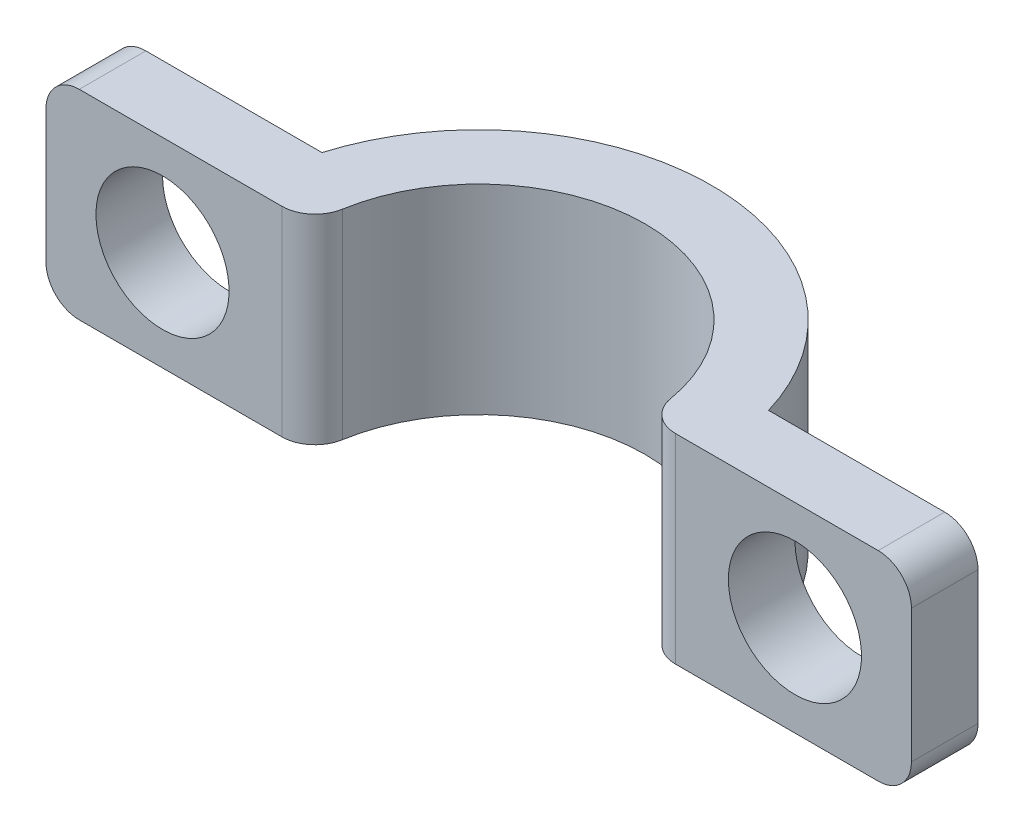
ISO-10303-21;
HEADER;
FILE_DESCRIPTION(('STEP AP214'),'2;1');
FILE_NAME('part.step','',(''),(''),'','','');
FILE_SCHEMA(('AUTOMOTIVE_DESIGN { 1 0 10303 214 1 1 1 1 }'));
ENDSEC;
DATA;
#1=APPLICATION_CONTEXT('core data for automotive mechanical design processes');
#2=APPLICATION_PROTOCOL_DEFINITION('international standard','automotive_design',2000,#1);
#3=PRODUCT_CONTEXT('',#1,'mechanical');
#4=PRODUCT('Part','Part','',(#3));
#5=PRODUCT_RELATED_PRODUCT_CATEGORY('part','',(#4));
#6=PRODUCT_DEFINITION_FORMATION('','',#4);
#7=PRODUCT_DEFINITION_CONTEXT('part definition',#1,'design');
#8=PRODUCT_DEFINITION('design','',#6,#7);
#9=PRODUCT_DEFINITION_SHAPE('','',#8);
#10=(LENGTH_UNIT() NAMED_UNIT(*) SI_UNIT(.MILLI.,.METRE.));
#11=(NAMED_UNIT(*) PLANE_ANGLE_UNIT() SI_UNIT($,.RADIAN.));
#12=(NAMED_UNIT(*) SI_UNIT($,.STERADIAN.) SOLID_ANGLE_UNIT());
#13=UNCERTAINTY_MEASURE_WITH_UNIT(LENGTH_MEASURE(1.E-05),#10,'distance_accuracy_value','');
#14=(GEOMETRIC_REPRESENTATION_CONTEXT(3) GLOBAL_UNCERTAINTY_ASSIGNED_CONTEXT((#13)) GLOBAL_UNIT_ASSIGNED_CONTEXT((#10,
#11,#12)) REPRESENTATION_CONTEXT('',''));
#15=CARTESIAN_POINT('',(0.,0.,0.));
#16=DIRECTION('',(0.,0.,1.));
#17=DIRECTION('',(1.,0.,0.));
#18=AXIS2_PLACEMENT_3D('',#15,#16,#17);
#19=CARTESIAN_POINT('',(0.,6.,0.));
#20=DIRECTION('',(0.,-1.,0.));
#21=DIRECTION('',(0.,0.,-1.));
#22=AXIS2_PLACEMENT_3D('',#19,#20,#21);
#23=CYLINDRICAL_SURFACE('',#22,5.);
#24=CARTESIAN_POINT('',(0.,0.,0.));
#25=DIRECTION('',(0.,-1.,0.));
#26=DIRECTION('',(0.,0.,1.));
#27=AXIS2_PLACEMENT_3D('',#24,#25,#26);
#28=CIRCLE('',#27,5.);
#29=CARTESIAN_POINT('',(-4.93006648591635,0.,-0.833333333333333));
#30=VERTEX_POINT('',#29);
#31=CARTESIAN_POINT('',(4.93006648591635,0.,-0.833333333333333));
#32=VERTEX_POINT('',#31);
#33=EDGE_CURVE('E180',#30,#32,#28,.T.);
#34=ORIENTED_EDGE('',*,*,#33,.T.);
#35=DIRECTION('',(0.,-1.,0.));
#36=VECTOR('',#35,1.);
#37=CARTESIAN_POINT('',(4.93006648591635,6.,-0.833333333333333));
#38=LINE('',#37,#36);
#39=CARTESIAN_POINT('',(4.93006648591635,6.,-0.833333333333333));
#40=VERTEX_POINT('',#39);
#41=EDGE_CURVE('E210',#32,#40,#38,.F.);
#42=ORIENTED_EDGE('',*,*,#41,.T.);
#43=CARTESIAN_POINT('',(0.,6.,0.));
#44=DIRECTION('',(0.,-1.,0.));
#45=DIRECTION('',(0.,0.,1.));
#46=AXIS2_PLACEMENT_3D('',#43,#44,#45);
#47=CIRCLE('',#46,5.);
#48=CARTESIAN_POINT('',(-4.93006648591635,6.,-0.833333333333333));
#49=VERTEX_POINT('',#48);
#50=EDGE_CURVE('E176',#49,#40,#47,.T.);
#51=ORIENTED_EDGE('',*,*,#50,.F.);
#52=DIRECTION('',(0.,-1.,0.));
#53=VECTOR('',#52,1.);
#54=CARTESIAN_POINT('',(-4.93006648591635,6.,-0.833333333333333));
#55=LINE('',#54,#53);
#56=EDGE_CURVE('E207',#49,#30,#55,.T.);
#57=ORIENTED_EDGE('',*,*,#56,.T.);
#58=EDGE_LOOP('',(#34,#42,#51,#57));
#59=FACE_BOUND('',#58,.T.);
#60=ADVANCED_FACE('F39',(#59),#23,.F.);
#61=CARTESIAN_POINT('',(5.,6.,0.));
#62=DIRECTION('',(0.,0.,-1.));
#63=DIRECTION('',(-1.,0.,0.));
#64=AXIS2_PLACEMENT_3D('',#61,#62,#63);
#65=PLANE('',#64);
#66=CARTESIAN_POINT('',(9.5,3.,0.));
#67=DIRECTION('',(0.,0.,-1.));
#68=DIRECTION('',(-1.,0.,0.));
#69=AXIS2_PLACEMENT_3D('',#66,#67,#68);
#70=CIRCLE('',#69,2.);
#71=CARTESIAN_POINT('',(7.5,3.,0.));
#72=VERTEX_POINT('',#71);
#73=EDGE_CURVE('E153',#72,#72,#70,.T.);
#74=ORIENTED_EDGE('',*,*,#73,.T.);
#75=EDGE_LOOP('',(#74));
#76=FACE_BOUND('',#75,.T.);
#77=DIRECTION('',(1.,0.,0.));
#78=VECTOR('',#77,1.);
#79=CARTESIAN_POINT('',(5.,6.,0.));
#80=LINE('',#79,#78);
#81=CARTESIAN_POINT('',(5.91607978309962,6.,0.));
#82=VERTEX_POINT('',#81);
#83=CARTESIAN_POINT('',(12.,6.,0.));
#84=VERTEX_POINT('',#83);
#85=EDGE_CURVE('E170',#82,#84,#80,.T.);
#86=ORIENTED_EDGE('',*,*,#85,.F.);
#87=DIRECTION('',(0.,-1.,0.));
#88=VECTOR('',#87,1.);
#89=CARTESIAN_POINT('',(5.91607978309962,6.,0.));
#90=LINE('',#89,#88);
#91=CARTESIAN_POINT('',(5.91607978309962,0.,0.));
#92=VERTEX_POINT('',#91);
#93=EDGE_CURVE('E194',#82,#92,#90,.T.);
#94=ORIENTED_EDGE('',*,*,#93,.T.);
#95=DIRECTION('',(1.,0.,0.));
#96=VECTOR('',#95,1.);
#97=CARTESIAN_POINT('',(5.,0.,0.));
#98=LINE('',#97,#96);
#99=CARTESIAN_POINT('',(12.,0.,0.));
#100=VERTEX_POINT('',#99);
#101=EDGE_CURVE('E183',#92,#100,#98,.T.);
#102=ORIENTED_EDGE('',*,*,#101,.T.);
#103=CARTESIAN_POINT('',(12.,1.,0.));
#104=DIRECTION('',(0.,0.,-1.));
#105=DIRECTION('',(-1.,0.,0.));
#106=AXIS2_PLACEMENT_3D('',#103,#104,#105);
#107=CIRCLE('',#106,1.);
#108=CARTESIAN_POINT('',(13.,1.,0.));
#109=VERTEX_POINT('',#108);
#110=EDGE_CURVE('E192',#100,#109,#107,.F.);
#111=ORIENTED_EDGE('',*,*,#110,.T.);
#112=DIRECTION('',(0.,1.,0.));
#113=VECTOR('',#112,1.);
#114=CARTESIAN_POINT('',(13.,-6.60202224738878,0.));
#115=LINE('',#114,#113);
#116=CARTESIAN_POINT('',(13.,5.,0.));
#117=VERTEX_POINT('',#116);
#118=EDGE_CURVE('E238',#109,#117,#115,.T.);
#119=ORIENTED_EDGE('',*,*,#118,.T.);
#120=CARTESIAN_POINT('',(12.,5.,0.));
#121=DIRECTION('',(0.,0.,-1.));
#122=DIRECTION('',(-1.,0.,0.));
#123=AXIS2_PLACEMENT_3D('',#120,#121,#122);
#124=CIRCLE('',#123,1.);
#125=EDGE_CURVE('E173',#117,#84,#124,.F.);
#126=ORIENTED_EDGE('',*,*,#125,.T.);
#127=EDGE_LOOP('',(#86,#94,#102,#111,#119,#126));
#128=FACE_BOUND('',#127,.T.);
#129=ADVANCED_FACE('F244',(#76,#128),#65,.F.);
#130=CARTESIAN_POINT('',(0.,6.,0.));
#131=DIRECTION('',(0.,-1.,0.));
#132=DIRECTION('',(0.,0.,-1.));
#133=AXIS2_PLACEMENT_3D('',#130,#131,#132);
#134=CYLINDRICAL_SURFACE('',#133,7.);
#135=CARTESIAN_POINT('',(0.,0.,0.));
#136=DIRECTION('',(0.,1.,0.));
#137=DIRECTION('',(0.,0.,1.));
#138=AXIS2_PLACEMENT_3D('',#135,#136,#137);
#139=CIRCLE('',#138,7.);
#140=CARTESIAN_POINT('',(6.70820393249937,0.,-2.));
#141=VERTEX_POINT('',#140);
#142=CARTESIAN_POINT('',(-6.70820393249937,0.,-2.));
#143=VERTEX_POINT('',#142);
#144=EDGE_CURVE('E161',#141,#143,#139,.T.);
#145=ORIENTED_EDGE('',*,*,#144,.T.);
#146=DIRECTION('',(0.,1.,0.));
#147=VECTOR('',#146,1.);
#148=CARTESIAN_POINT('',(-6.70820393249937,-6.60202224738878,-2.));
#149=LINE('',#148,#147);
#150=CARTESIAN_POINT('',(-6.70820393249937,6.,-2.));
#151=VERTEX_POINT('',#150);
#152=EDGE_CURVE('E143',#143,#151,#149,.T.);
#153=ORIENTED_EDGE('',*,*,#152,.T.);
#154=CARTESIAN_POINT('',(0.,6.,0.));
#155=DIRECTION('',(0.,1.,0.));
#156=DIRECTION('',(0.,0.,1.));
#157=AXIS2_PLACEMENT_3D('',#154,#155,#156);
#158=CIRCLE('',#157,7.);
#159=CARTESIAN_POINT('',(6.70820393249937,6.,-2.));
#160=VERTEX_POINT('',#159);
#161=EDGE_CURVE('E159',#160,#151,#158,.T.);
#162=ORIENTED_EDGE('',*,*,#161,.F.);
#163=DIRECTION('',(0.,1.,0.));
#164=VECTOR('',#163,1.);
#165=CARTESIAN_POINT('',(6.70820393249937,-6.60202224738878,-2.));
#166=LINE('',#165,#164);
#167=EDGE_CURVE('E250',#141,#160,#166,.T.);
#168=ORIENTED_EDGE('',*,*,#167,.F.);
#169=EDGE_LOOP('',(#145,#153,#162,#168));
#170=FACE_BOUND('',#169,.T.);
#171=ADVANCED_FACE('F157',(#170),#134,.T.);
#172=CARTESIAN_POINT('',(-5.,6.,0.));
#173=DIRECTION('',(0.,0.,-1.));
#174=DIRECTION('',(-1.,0.,0.));
#175=AXIS2_PLACEMENT_3D('',#172,#173,#174);
#176=PLANE('',#175);
#177=CARTESIAN_POINT('',(-9.5,3.,0.));
#178=DIRECTION('',(0.,0.,-1.));
#179=DIRECTION('',(-1.,0.,0.));
#180=AXIS2_PLACEMENT_3D('',#177,#178,#179);
#181=CIRCLE('',#180,2.);
#182=CARTESIAN_POINT('',(-11.5,3.,0.));
#183=VERTEX_POINT('',#182);
#184=EDGE_CURVE('E319',#183,#183,#181,.T.);
#185=ORIENTED_EDGE('',*,*,#184,.T.);
#186=EDGE_LOOP('',(#185));
#187=FACE_BOUND('',#186,.T.);
#188=DIRECTION('',(1.,0.,0.));
#189=VECTOR('',#188,1.);
#190=CARTESIAN_POINT('',(-5.,0.,0.));
#191=LINE('',#190,#189);
#192=CARTESIAN_POINT('',(-12.,0.,0.));
#193=VERTEX_POINT('',#192);
#194=CARTESIAN_POINT('',(-5.91607978309962,0.,0.));
#195=VERTEX_POINT('',#194);
#196=EDGE_CURVE('E188',#193,#195,#191,.T.);
#197=ORIENTED_EDGE('',*,*,#196,.T.);
#198=DIRECTION('',(0.,-1.,0.));
#199=VECTOR('',#198,1.);
#200=CARTESIAN_POINT('',(-5.91607978309962,6.,0.));
#201=LINE('',#200,#199);
#202=CARTESIAN_POINT('',(-5.91607978309962,6.,0.));
#203=VERTEX_POINT('',#202);
#204=EDGE_CURVE('E224',#195,#203,#201,.F.);
#205=ORIENTED_EDGE('',*,*,#204,.T.);
#206=DIRECTION('',(1.,0.,0.));
#207=VECTOR('',#206,1.);
#208=CARTESIAN_POINT('',(-5.,6.,0.));
#209=LINE('',#208,#207);
#210=CARTESIAN_POINT('',(-12.,6.,0.));
#211=VERTEX_POINT('',#210);
#212=EDGE_CURVE('E169',#211,#203,#209,.T.);
#213=ORIENTED_EDGE('',*,*,#212,.F.);
#214=CARTESIAN_POINT('',(-12.,5.,0.));
#215=DIRECTION('',(0.,0.,-1.));
#216=DIRECTION('',(-1.,0.,0.));
#217=AXIS2_PLACEMENT_3D('',#214,#215,#216);
#218=CIRCLE('',#217,1.);
#219=CARTESIAN_POINT('',(-13.,5.,0.));
#220=VERTEX_POINT('',#219);
#221=EDGE_CURVE('E220',#211,#220,#218,.F.);
#222=ORIENTED_EDGE('',*,*,#221,.T.);
#223=DIRECTION('',(0.,1.,0.));
#224=VECTOR('',#223,1.);
#225=CARTESIAN_POINT('',(-13.,-6.60202224738878,0.));
#226=LINE('',#225,#224);
#227=CARTESIAN_POINT('',(-13.,1.,0.));
#228=VERTEX_POINT('',#227);
#229=EDGE_CURVE('E163',#228,#220,#226,.T.);
#230=ORIENTED_EDGE('',*,*,#229,.F.);
#231=CARTESIAN_POINT('',(-12.,1.,0.));
#232=DIRECTION('',(0.,0.,-1.));
#233=DIRECTION('',(-1.,0.,0.));
#234=AXIS2_PLACEMENT_3D('',#231,#232,#233);
#235=CIRCLE('',#234,1.);
#236=EDGE_CURVE('E222',#228,#193,#235,.F.);
#237=ORIENTED_EDGE('',*,*,#236,.T.);
#238=EDGE_LOOP('',(#197,#205,#213,#222,#230,#237));
#239=FACE_BOUND('',#238,.T.);
#240=ADVANCED_FACE('F305',(#187,#239),#176,.F.);
#241=CARTESIAN_POINT('',(0.,6.,0.));
#242=DIRECTION('',(0.,1.,0.));
#243=DIRECTION('',(0.,0.,1.));
#244=AXIS2_PLACEMENT_3D('',#241,#242,#243);
#245=PLANE('',#244);
#246=ORIENTED_EDGE('',*,*,#50,.T.);
#247=CARTESIAN_POINT('',(5.91607978309962,6.,-1.));
#248=DIRECTION('',(0.,1.,0.));
#249=DIRECTION('',(0.,0.,1.));
#250=AXIS2_PLACEMENT_3D('',#247,#248,#249);
#251=CIRCLE('',#250,1.);
#252=EDGE_CURVE('E218',#40,#82,#251,.T.);
#253=ORIENTED_EDGE('',*,*,#252,.T.);
#254=ORIENTED_EDGE('',*,*,#85,.T.);
#255=DIRECTION('',(0.,0.,-1.));
#256=VECTOR('',#255,1.);
#257=CARTESIAN_POINT('',(12.,6.,0.));
#258=LINE('',#257,#256);
#259=CARTESIAN_POINT('',(12.,6.,-2.));
#260=VERTEX_POINT('',#259);
#261=EDGE_CURVE('E214',#84,#260,#258,.T.);
#262=ORIENTED_EDGE('',*,*,#261,.T.);
#263=DIRECTION('',(-1.,0.,0.));
#264=VECTOR('',#263,1.);
#265=CARTESIAN_POINT('',(13.,6.,-2.));
#266=LINE('',#265,#264);
#267=EDGE_CURVE('E168',#260,#160,#266,.T.);
#268=ORIENTED_EDGE('',*,*,#267,.T.);
#269=ORIENTED_EDGE('',*,*,#161,.T.);
#270=DIRECTION('',(-1.,0.,0.));
#271=VECTOR('',#270,1.);
#272=CARTESIAN_POINT('',(-13.,6.,-2.));
#273=LINE('',#272,#271);
#274=CARTESIAN_POINT('',(-12.,6.,-2.));
#275=VERTEX_POINT('',#274);
#276=EDGE_CURVE('E139',#151,#275,#273,.T.);
#277=ORIENTED_EDGE('',*,*,#276,.T.);
#278=DIRECTION('',(0.,0.,1.));
#279=VECTOR('',#278,1.);
#280=CARTESIAN_POINT('',(-12.,6.,0.));
#281=LINE('',#280,#279);
#282=EDGE_CURVE('E212',#275,#211,#281,.T.);
#283=ORIENTED_EDGE('',*,*,#282,.T.);
#284=ORIENTED_EDGE('',*,*,#212,.T.);
#285=CARTESIAN_POINT('',(-5.91607978309962,6.,-1.));
#286=DIRECTION('',(0.,1.,0.));
#287=DIRECTION('',(0.,0.,1.));
#288=AXIS2_PLACEMENT_3D('',#285,#286,#287);
#289=CIRCLE('',#288,1.);
#290=EDGE_CURVE('E216',#203,#49,#289,.T.);
#291=ORIENTED_EDGE('',*,*,#290,.T.);
#292=EDGE_LOOP('',(#246,#253,#254,#262,#268,#269,#277,#283,#284,#291));
#293=FACE_BOUND('',#292,.T.);
#294=ADVANCED_FACE('F166',(#293),#245,.T.);
#295=CARTESIAN_POINT('',(0.,0.,0.));
#296=DIRECTION('',(0.,1.,0.));
#297=DIRECTION('',(0.,0.,1.));
#298=AXIS2_PLACEMENT_3D('',#295,#296,#297);
#299=PLANE('',#298);
#300=ORIENTED_EDGE('',*,*,#101,.F.);
#301=CARTESIAN_POINT('',(5.91607978309962,0.,-1.));
#302=DIRECTION('',(0.,1.,0.));
#303=DIRECTION('',(0.,0.,1.));
#304=AXIS2_PLACEMENT_3D('',#301,#302,#303);
#305=CIRCLE('',#304,1.);
#306=EDGE_CURVE('E205',#92,#32,#305,.F.);
#307=ORIENTED_EDGE('',*,*,#306,.T.);
#308=ORIENTED_EDGE('',*,*,#33,.F.);
#309=CARTESIAN_POINT('',(-5.91607978309962,0.,-1.));
#310=DIRECTION('',(0.,1.,0.));
#311=DIRECTION('',(0.,0.,1.));
#312=AXIS2_PLACEMENT_3D('',#309,#310,#311);
#313=CIRCLE('',#312,1.);
#314=EDGE_CURVE('E203',#30,#195,#313,.F.);
#315=ORIENTED_EDGE('',*,*,#314,.T.);
#316=ORIENTED_EDGE('',*,*,#196,.F.);
#317=DIRECTION('',(0.,0.,-1.));
#318=VECTOR('',#317,1.);
#319=CARTESIAN_POINT('',(-12.,0.,-2.));
#320=LINE('',#319,#318);
#321=CARTESIAN_POINT('',(-12.,0.,-2.));
#322=VERTEX_POINT('',#321);
#323=EDGE_CURVE('E200',#193,#322,#320,.T.);
#324=ORIENTED_EDGE('',*,*,#323,.T.);
#325=DIRECTION('',(1.,0.,0.));
#326=VECTOR('',#325,1.);
#327=CARTESIAN_POINT('',(-13.,0.,-2.));
#328=LINE('',#327,#326);
#329=EDGE_CURVE('E162',#322,#143,#328,.T.);
#330=ORIENTED_EDGE('',*,*,#329,.T.);
#331=ORIENTED_EDGE('',*,*,#144,.F.);
#332=DIRECTION('',(1.,0.,0.));
#333=VECTOR('',#332,1.);
#334=CARTESIAN_POINT('',(13.,0.,-2.));
#335=LINE('',#334,#333);
#336=CARTESIAN_POINT('',(12.,0.,-2.));
#337=VERTEX_POINT('',#336);
#338=EDGE_CURVE('E184',#141,#337,#335,.T.);
#339=ORIENTED_EDGE('',*,*,#338,.T.);
#340=DIRECTION('',(0.,0.,1.));
#341=VECTOR('',#340,1.);
#342=CARTESIAN_POINT('',(12.,0.,0.));
#343=LINE('',#342,#341);
#344=EDGE_CURVE('E197',#337,#100,#343,.T.);
#345=ORIENTED_EDGE('',*,*,#344,.T.);
#346=EDGE_LOOP('',(#300,#307,#308,#315,#316,#324,#330,#331,#339,#345));
#347=FACE_BOUND('',#346,.T.);
#348=ADVANCED_FACE('F268',(#347),#299,.F.);
#349=CARTESIAN_POINT('',(13.,-6.60202224738878,-2.));
#350=DIRECTION('',(0.,0.,-1.));
#351=DIRECTION('',(-1.,0.,0.));
#352=AXIS2_PLACEMENT_3D('',#349,#350,#351);
#353=PLANE('',#352);
#354=CARTESIAN_POINT('',(9.5,3.,-2.));
#355=DIRECTION('',(0.,0.,-1.));
#356=DIRECTION('',(-1.,0.,0.));
#357=AXIS2_PLACEMENT_3D('',#354,#355,#356);
#358=CIRCLE('',#357,2.);
#359=CARTESIAN_POINT('',(7.5,3.,-2.));
#360=VERTEX_POINT('',#359);
#361=EDGE_CURVE('E322',#360,#360,#358,.T.);
#362=ORIENTED_EDGE('',*,*,#361,.F.);
#363=EDGE_LOOP('',(#362));
#364=FACE_BOUND('',#363,.T.);
#365=DIRECTION('',(0.,1.,0.));
#366=VECTOR('',#365,1.);
#367=CARTESIAN_POINT('',(13.,-6.60202224738878,-2.));
#368=LINE('',#367,#366);
#369=CARTESIAN_POINT('',(13.,1.,-2.));
#370=VERTEX_POINT('',#369);
#371=CARTESIAN_POINT('',(13.,5.,-2.));
#372=VERTEX_POINT('',#371);
#373=EDGE_CURVE('E239',#370,#372,#368,.T.);
#374=ORIENTED_EDGE('',*,*,#373,.F.);
#375=CARTESIAN_POINT('',(12.,1.,-2.));
#376=DIRECTION('',(0.,0.,-1.));
#377=DIRECTION('',(-1.,0.,0.));
#378=AXIS2_PLACEMENT_3D('',#375,#376,#377);
#379=CIRCLE('',#378,1.);
#380=EDGE_CURVE('E11',#370,#337,#379,.T.);
#381=ORIENTED_EDGE('',*,*,#380,.T.);
#382=ORIENTED_EDGE('',*,*,#338,.F.);
#383=ORIENTED_EDGE('',*,*,#167,.T.);
#384=ORIENTED_EDGE('',*,*,#267,.F.);
#385=CARTESIAN_POINT('',(12.,5.,-2.));
#386=DIRECTION('',(0.,0.,-1.));
#387=DIRECTION('',(-1.,0.,0.));
#388=AXIS2_PLACEMENT_3D('',#385,#386,#387);
#389=CIRCLE('',#388,1.);
#390=EDGE_CURVE('E47',#260,#372,#389,.T.);
#391=ORIENTED_EDGE('',*,*,#390,.T.);
#392=EDGE_LOOP('',(#374,#381,#382,#383,#384,#391));
#393=FACE_BOUND('',#392,.T.);
#394=ADVANCED_FACE('F248',(#364,#393),#353,.T.);
#395=CARTESIAN_POINT('',(13.,-6.60202224738878,0.));
#396=DIRECTION('',(1.,0.,0.));
#397=DIRECTION('',(0.,0.,-1.));
#398=AXIS2_PLACEMENT_3D('',#395,#396,#397);
#399=PLANE('',#398);
#400=ORIENTED_EDGE('',*,*,#118,.F.);
#401=DIRECTION('',(0.,0.,1.));
#402=VECTOR('',#401,1.);
#403=CARTESIAN_POINT('',(13.,1.,-2.));
#404=LINE('',#403,#402);
#405=EDGE_CURVE('E60',#109,#370,#404,.F.);
#406=ORIENTED_EDGE('',*,*,#405,.T.);
#407=ORIENTED_EDGE('',*,*,#373,.T.);
#408=DIRECTION('',(0.,0.,-1.));
#409=VECTOR('',#408,1.);
#410=CARTESIAN_POINT('',(13.,5.,0.));
#411=LINE('',#410,#409);
#412=EDGE_CURVE('E233',#372,#117,#411,.F.);
#413=ORIENTED_EDGE('',*,*,#412,.T.);
#414=EDGE_LOOP('',(#400,#406,#407,#413));
#415=FACE_BOUND('',#414,.T.);
#416=ADVANCED_FACE('F237',(#415),#399,.T.);
#417=CARTESIAN_POINT('',(-13.,-6.60202224738878,-2.));
#418=DIRECTION('',(0.,0.,-1.));
#419=DIRECTION('',(-1.,0.,0.));
#420=AXIS2_PLACEMENT_3D('',#417,#418,#419);
#421=PLANE('',#420);
#422=CARTESIAN_POINT('',(-9.5,3.,-2.));
#423=DIRECTION('',(0.,0.,-1.));
#424=DIRECTION('',(1.,0.,0.));
#425=AXIS2_PLACEMENT_3D('',#422,#423,#424);
#426=CIRCLE('',#425,2.);
#427=CARTESIAN_POINT('',(-7.5,3.,-2.));
#428=VERTEX_POINT('',#427);
#429=EDGE_CURVE('E323',#428,#428,#426,.T.);
#430=ORIENTED_EDGE('',*,*,#429,.F.);
#431=EDGE_LOOP('',(#430));
#432=FACE_BOUND('',#431,.T.);
#433=ORIENTED_EDGE('',*,*,#329,.F.);
#434=CARTESIAN_POINT('',(-12.,1.,-2.));
#435=DIRECTION('',(0.,0.,-1.));
#436=DIRECTION('',(-1.,0.,0.));
#437=AXIS2_PLACEMENT_3D('',#434,#435,#436);
#438=CIRCLE('',#437,1.);
#439=CARTESIAN_POINT('',(-13.,1.,-2.));
#440=VERTEX_POINT('',#439);
#441=EDGE_CURVE('E227',#322,#440,#438,.T.);
#442=ORIENTED_EDGE('',*,*,#441,.T.);
#443=DIRECTION('',(0.,1.,0.));
#444=VECTOR('',#443,1.);
#445=CARTESIAN_POINT('',(-13.,-6.60202224738878,-2.));
#446=LINE('',#445,#444);
#447=CARTESIAN_POINT('',(-13.,5.,-2.));
#448=VERTEX_POINT('',#447);
#449=EDGE_CURVE('E152',#440,#448,#446,.T.);
#450=ORIENTED_EDGE('',*,*,#449,.T.);
#451=CARTESIAN_POINT('',(-12.,5.,-2.));
#452=DIRECTION('',(0.,0.,-1.));
#453=DIRECTION('',(-1.,0.,0.));
#454=AXIS2_PLACEMENT_3D('',#451,#452,#453);
#455=CIRCLE('',#454,1.);
#456=EDGE_CURVE('E147',#448,#275,#455,.T.);
#457=ORIENTED_EDGE('',*,*,#456,.T.);
#458=ORIENTED_EDGE('',*,*,#276,.F.);
#459=ORIENTED_EDGE('',*,*,#152,.F.);
#460=EDGE_LOOP('',(#433,#442,#450,#457,#458,#459));
#461=FACE_BOUND('',#460,.T.);
#462=ADVANCED_FACE('F142',(#432,#461),#421,.T.);
#463=CARTESIAN_POINT('',(-13.,-6.60202224738878,0.));
#464=DIRECTION('',(-1.,0.,0.));
#465=DIRECTION('',(0.,0.,1.));
#466=AXIS2_PLACEMENT_3D('',#463,#464,#465);
#467=PLANE('',#466);
#468=ORIENTED_EDGE('',*,*,#449,.F.);
#469=DIRECTION('',(0.,0.,-1.));
#470=VECTOR('',#469,1.);
#471=CARTESIAN_POINT('',(-13.,1.,0.));
#472=LINE('',#471,#470);
#473=EDGE_CURVE('E231',#440,#228,#472,.F.);
#474=ORIENTED_EDGE('',*,*,#473,.T.);
#475=ORIENTED_EDGE('',*,*,#229,.T.);
#476=DIRECTION('',(0.,0.,1.));
#477=VECTOR('',#476,1.);
#478=CARTESIAN_POINT('',(-13.,5.,0.));
#479=LINE('',#478,#477);
#480=EDGE_CURVE('E229',#220,#448,#479,.F.);
#481=ORIENTED_EDGE('',*,*,#480,.T.);
#482=EDGE_LOOP('',(#468,#474,#475,#481));
#483=FACE_BOUND('',#482,.T.);
#484=ADVANCED_FACE('F313',(#483),#467,.T.);
#485=CARTESIAN_POINT('',(-9.5,3.,4.));
#486=DIRECTION('',(0.,0.,-1.));
#487=DIRECTION('',(-1.,0.,0.));
#488=AXIS2_PLACEMENT_3D('',#485,#486,#487);
#489=CYLINDRICAL_SURFACE('',#488,2.);
#490=ORIENTED_EDGE('',*,*,#429,.T.);
#491=EDGE_LOOP('',(#490));
#492=FACE_BOUND('',#491,.T.);
#493=ORIENTED_EDGE('',*,*,#184,.F.);
#494=EDGE_LOOP('',(#493));
#495=FACE_BOUND('',#494,.T.);
#496=ADVANCED_FACE('F392',(#492,#495),#489,.F.);
#497=CARTESIAN_POINT('',(9.5,3.,4.));
#498=DIRECTION('',(0.,0.,-1.));
#499=DIRECTION('',(-1.,0.,0.));
#500=AXIS2_PLACEMENT_3D('',#497,#498,#499);
#501=CYLINDRICAL_SURFACE('',#500,2.);
#502=ORIENTED_EDGE('',*,*,#361,.T.);
#503=EDGE_LOOP('',(#502));
#504=FACE_BOUND('',#503,.T.);
#505=ORIENTED_EDGE('',*,*,#73,.F.);
#506=EDGE_LOOP('',(#505));
#507=FACE_BOUND('',#506,.T.);
#508=ADVANCED_FACE('F296',(#504,#507),#501,.F.);
#509=CARTESIAN_POINT('',(5.91607978309962,6.,-1.));
#510=DIRECTION('',(0.,-1.,0.));
#511=DIRECTION('',(0.,0.,-1.));
#512=AXIS2_PLACEMENT_3D('',#509,#510,#511);
#513=CYLINDRICAL_SURFACE('',#512,1.);
#514=ORIENTED_EDGE('',*,*,#252,.F.);
#515=ORIENTED_EDGE('',*,*,#41,.F.);
#516=ORIENTED_EDGE('',*,*,#306,.F.);
#517=ORIENTED_EDGE('',*,*,#93,.F.);
#518=EDGE_LOOP('',(#514,#515,#516,#517));
#519=FACE_BOUND('',#518,.T.);
#520=ADVANCED_FACE('F265',(#519),#513,.T.);
#521=CARTESIAN_POINT('',(-5.91607978309962,6.,-1.));
#522=DIRECTION('',(0.,-1.,0.));
#523=DIRECTION('',(0.,0.,-1.));
#524=AXIS2_PLACEMENT_3D('',#521,#522,#523);
#525=CYLINDRICAL_SURFACE('',#524,1.);
#526=ORIENTED_EDGE('',*,*,#290,.F.);
#527=ORIENTED_EDGE('',*,*,#204,.F.);
#528=ORIENTED_EDGE('',*,*,#314,.F.);
#529=ORIENTED_EDGE('',*,*,#56,.F.);
#530=EDGE_LOOP('',(#526,#527,#528,#529));
#531=FACE_BOUND('',#530,.T.);
#532=ADVANCED_FACE('F282',(#531),#525,.T.);
#533=CARTESIAN_POINT('',(-12.,1.,0.));
#534=DIRECTION('',(0.,0.,1.));
#535=DIRECTION('',(1.,0.,0.));
#536=AXIS2_PLACEMENT_3D('',#533,#534,#535);
#537=CYLINDRICAL_SURFACE('',#536,1.);
#538=ORIENTED_EDGE('',*,*,#236,.F.);
#539=ORIENTED_EDGE('',*,*,#473,.F.);
#540=ORIENTED_EDGE('',*,*,#441,.F.);
#541=ORIENTED_EDGE('',*,*,#323,.F.);
#542=EDGE_LOOP('',(#538,#539,#540,#541));
#543=FACE_BOUND('',#542,.T.);
#544=ADVANCED_FACE('F276',(#543),#537,.T.);
#545=CARTESIAN_POINT('',(12.,1.,0.));
#546=DIRECTION('',(0.,0.,-1.));
#547=DIRECTION('',(-1.,0.,0.));
#548=AXIS2_PLACEMENT_3D('',#545,#546,#547);
#549=CYLINDRICAL_SURFACE('',#548,1.);
#550=ORIENTED_EDGE('',*,*,#380,.F.);
#551=ORIENTED_EDGE('',*,*,#405,.F.);
#552=ORIENTED_EDGE('',*,*,#110,.F.);
#553=ORIENTED_EDGE('',*,*,#344,.F.);
#554=EDGE_LOOP('',(#550,#551,#552,#553));
#555=FACE_BOUND('',#554,.T.);
#556=ADVANCED_FACE('F274',(#555),#549,.T.);
#557=CARTESIAN_POINT('',(12.,5.,0.));
#558=DIRECTION('',(0.,0.,-1.));
#559=DIRECTION('',(-1.,0.,0.));
#560=AXIS2_PLACEMENT_3D('',#557,#558,#559);
#561=CYLINDRICAL_SURFACE('',#560,1.);
#562=ORIENTED_EDGE('',*,*,#125,.F.);
#563=ORIENTED_EDGE('',*,*,#412,.F.);
#564=ORIENTED_EDGE('',*,*,#390,.F.);
#565=ORIENTED_EDGE('',*,*,#261,.F.);
#566=EDGE_LOOP('',(#562,#563,#564,#565));
#567=FACE_BOUND('',#566,.T.);
#568=ADVANCED_FACE('F247',(#567),#561,.T.);
#569=CARTESIAN_POINT('',(-12.,5.,0.));
#570=DIRECTION('',(0.,0.,1.));
#571=DIRECTION('',(1.,0.,0.));
#572=AXIS2_PLACEMENT_3D('',#569,#570,#571);
#573=CYLINDRICAL_SURFACE('',#572,1.);
#574=ORIENTED_EDGE('',*,*,#456,.F.);
#575=ORIENTED_EDGE('',*,*,#480,.F.);
#576=ORIENTED_EDGE('',*,*,#221,.F.);
#577=ORIENTED_EDGE('',*,*,#282,.F.);
#578=EDGE_LOOP('',(#574,#575,#576,#577));
#579=FACE_BOUND('',#578,.T.);
#580=ADVANCED_FACE('F41',(#579),#573,.T.);
#581=CLOSED_SHELL('',(#60,#129,#171,#240,#294,#348,#394,#416,#462,#484,#496,#508,#520,#532,#544,
#556,#568,#580));
#582=MANIFOLD_SOLID_BREP('B2',#581);
#583=ADVANCED_BREP_SHAPE_REPRESENTATION('',(#18,#582),#14);
#584=SHAPE_DEFINITION_REPRESENTATION(#9,#583);
ENDSEC;
END-ISO-10303-21;
